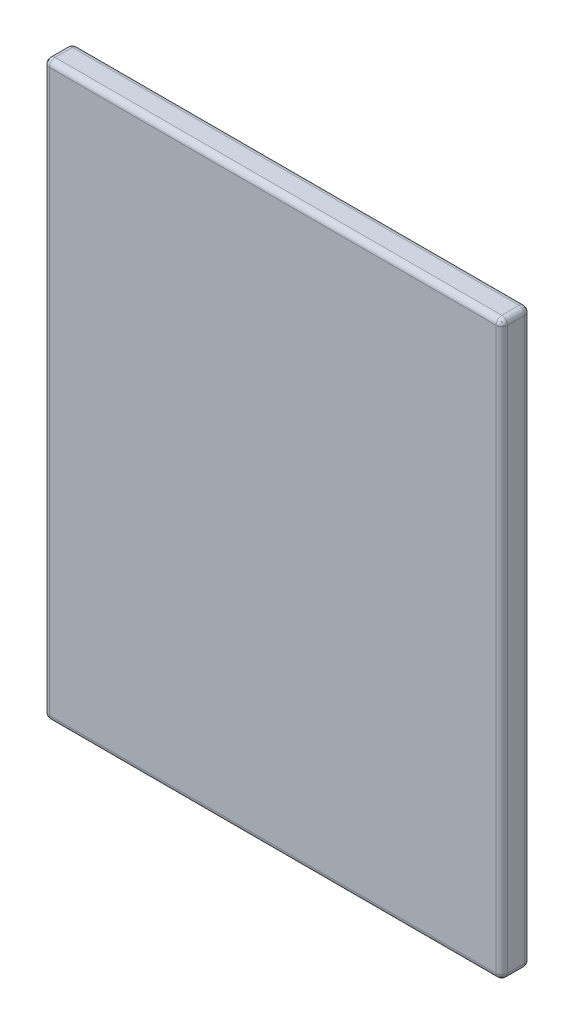
ISO-10303-21;
HEADER;
FILE_DESCRIPTION(('STEP AP214'),'2;1');
FILE_NAME('part.step','',(''),(''),'','','');
FILE_SCHEMA(('AUTOMOTIVE_DESIGN { 1 0 10303 214 1 1 1 1 }'));
ENDSEC;
DATA;
#1=APPLICATION_CONTEXT('core data for automotive mechanical design processes');
#2=APPLICATION_PROTOCOL_DEFINITION('international standard','automotive_design',2000,#1);
#3=PRODUCT_CONTEXT('',#1,'mechanical');
#4=PRODUCT('Part','Part','',(#3));
#5=PRODUCT_RELATED_PRODUCT_CATEGORY('part','',(#4));
#6=PRODUCT_DEFINITION_FORMATION('','',#4);
#7=PRODUCT_DEFINITION_CONTEXT('part definition',#1,'design');
#8=PRODUCT_DEFINITION('design','',#6,#7);
#9=PRODUCT_DEFINITION_SHAPE('','',#8);
#10=(LENGTH_UNIT() NAMED_UNIT(*) SI_UNIT(.MILLI.,.METRE.));
#11=(NAMED_UNIT(*) PLANE_ANGLE_UNIT() SI_UNIT($,.RADIAN.));
#12=(NAMED_UNIT(*) SI_UNIT($,.STERADIAN.) SOLID_ANGLE_UNIT());
#13=UNCERTAINTY_MEASURE_WITH_UNIT(LENGTH_MEASURE(1.E-05),#10,'distance_accuracy_value','');
#14=(GEOMETRIC_REPRESENTATION_CONTEXT(3) GLOBAL_UNCERTAINTY_ASSIGNED_CONTEXT((#13)) GLOBAL_UNIT_ASSIGNED_CONTEXT((#10,
#11,#12)) REPRESENTATION_CONTEXT('',''));
#15=CARTESIAN_POINT('',(0.,0.,0.));
#16=DIRECTION('',(0.,0.,1.));
#17=DIRECTION('',(1.,0.,0.));
#18=AXIS2_PLACEMENT_3D('',#15,#16,#17);
#19=CARTESIAN_POINT('',(10.06001206845,13.985864610413,0.01));
#20=DIRECTION('',(-0.577350243953125,-0.577350294426125,-0.577350269189626));
#21=DIRECTION('',(0.707106812094878,-0.707106750278215,-1.15130127653629E-13));
#22=AXIS2_PLACEMENT_3D('',#19,#20,#21);
#23=SPHERICAL_SURFACE('',#22,0.01);
#24=CARTESIAN_POINT('',(10.0542385660105,13.9800911074687,0.00422649730810391));
#25=VERTEX_POINT('',#24);
#26=VERTEX_LOOP('',#25);
#27=FACE_BOUND('',#26,.T.);
#28=CARTESIAN_POINT('',(10.06001206845,13.985864610413,0.01));
#29=DIRECTION('',(0.,0.,-1.));
#30=DIRECTION('',(-1.,0.,0.));
#31=AXIS2_PLACEMENT_3D('',#28,#29,#30);
#32=CIRCLE('',#31,0.01);
#33=CARTESIAN_POINT('',(10.0500120684499,13.9858646099759,0.00999999999999999));
#34=VERTEX_POINT('',#33);
#35=CARTESIAN_POINT('',(10.0600120688871,13.9758646104131,0.01));
#36=VERTEX_POINT('',#35);
#37=EDGE_CURVE('E112',#34,#36,#32,.F.);
#38=ORIENTED_EDGE('',*,*,#37,.F.);
#39=CARTESIAN_POINT('',(10.0600120684497,13.985864610413,0.01));
#40=DIRECTION('',(-4.371138805985E-08,0.999999999999999,0.));
#41=DIRECTION('',(-0.999999999999999,-4.371138805985E-08,0.));
#42=AXIS2_PLACEMENT_3D('',#39,#40,#41);
#43=CIRCLE('',#42,0.01);
#44=CARTESIAN_POINT('',(10.06001206845,13.9858646104131,0.));
#45=VERTEX_POINT('',#44);
#46=EDGE_CURVE('E123',#45,#34,#43,.T.);
#47=ORIENTED_EDGE('',*,*,#46,.F.);
#48=CARTESIAN_POINT('',(10.0600120684499,13.9858646104133,0.00999999999999994));
#49=DIRECTION('',(-0.999999999999999,-4.371138802516E-08,0.));
#50=DIRECTION('',(4.371138802516E-08,-0.999999999999999,0.));
#51=AXIS2_PLACEMENT_3D('',#48,#49,#50);
#52=CIRCLE('',#51,0.01);
#53=EDGE_CURVE('E21',#36,#45,#52,.F.);
#54=ORIENTED_EDGE('',*,*,#53,.F.);
#55=EDGE_LOOP('',(#38,#47,#54));
#56=FACE_BOUND('',#55,.T.);
#57=ADVANCED_FACE('F17',(#27,#56),#23,.T.);
#58=CARTESIAN_POINT('',(10.060012025613,14.965864610413,0.01));
#59=DIRECTION('',(-0.577350294425946,0.577350243952984,-0.577350269189946));
#60=DIRECTION('',(0.707106781186808,3.09081850113912E-08,-0.707106781186286));
#61=AXIS2_PLACEMENT_3D('',#58,#59,#60);
#62=SPHERICAL_SURFACE('',#61,0.01);
#63=CARTESIAN_POINT('',(10.0542385226687,14.9716381128525,0.00422649730810062));
#64=VERTEX_POINT('',#63);
#65=VERTEX_LOOP('',#64);
#66=FACE_BOUND('',#65,.T.);
#67=CARTESIAN_POINT('',(10.060012025613,14.965864610413,0.01));
#68=DIRECTION('',(0.,0.,-1.));
#69=DIRECTION('',(-1.,0.,0.));
#70=AXIS2_PLACEMENT_3D('',#67,#68,#69);
#71=CIRCLE('',#70,0.01);
#72=CARTESIAN_POINT('',(10.0600120251759,14.9758646104133,0.00999999999999999));
#73=VERTEX_POINT('',#72);
#74=CARTESIAN_POINT('',(10.0500120256128,14.9658646099759,0.01));
#75=VERTEX_POINT('',#74);
#76=EDGE_CURVE('E224',#73,#75,#71,.F.);
#77=ORIENTED_EDGE('',*,*,#76,.F.);
#78=CARTESIAN_POINT('',(10.060012025613,14.9658646104138,0.00999999999999998));
#79=DIRECTION('',(0.999999999999999,4.371138802516E-08,0.));
#80=DIRECTION('',(-4.371138802516E-08,0.999999999999999,0.));
#81=AXIS2_PLACEMENT_3D('',#78,#79,#80);
#82=CIRCLE('',#81,0.01);
#83=CARTESIAN_POINT('',(10.0600120256128,14.9658646104135,0.));
#84=VERTEX_POINT('',#83);
#85=EDGE_CURVE('E175',#84,#73,#82,.T.);
#86=ORIENTED_EDGE('',*,*,#85,.F.);
#87=CARTESIAN_POINT('',(10.0600120256126,14.9658646104131,0.01));
#88=DIRECTION('',(-4.371138805985E-08,0.999999999999999,0.));
#89=DIRECTION('',(-0.999999999999999,-4.371138805985E-08,0.));
#90=AXIS2_PLACEMENT_3D('',#87,#88,#89);
#91=CIRCLE('',#90,0.01);
#92=EDGE_CURVE('E180',#75,#84,#91,.F.);
#93=ORIENTED_EDGE('',*,*,#92,.F.);
#94=EDGE_LOOP('',(#77,#86,#93));
#95=FACE_BOUND('',#94,.T.);
#96=ADVANCED_FACE('F167',(#66,#95),#62,.T.);
#97=CARTESIAN_POINT('',(10.84001206845,13.985864644508,0.01));
#98=DIRECTION('',(0.577350294425946,-0.577350243952984,-0.577350269189946));
#99=DIRECTION('',(0.707106781186808,3.09081850113912E-08,0.707106781186286));
#100=AXIS2_PLACEMENT_3D('',#97,#98,#99);
#101=SPHERICAL_SURFACE('',#100,0.01);
#102=CARTESIAN_POINT('',(10.8457855713943,13.9800911420685,0.00422649730810062));
#103=VERTEX_POINT('',#102);
#104=VERTEX_LOOP('',#103);
#105=FACE_BOUND('',#104,.T.);
#106=CARTESIAN_POINT('',(10.84001206845,13.985864644508,0.01));
#107=DIRECTION('',(0.,0.,-1.));
#108=DIRECTION('',(-1.,0.,0.));
#109=AXIS2_PLACEMENT_3D('',#106,#107,#108);
#110=CIRCLE('',#109,0.01);
#111=CARTESIAN_POINT('',(10.8400120688871,13.975864644508,0.00999999999999999));
#112=VERTEX_POINT('',#111);
#113=CARTESIAN_POINT('',(10.85001206845,13.9858646449451,0.01));
#114=VERTEX_POINT('',#113);
#115=EDGE_CURVE('E222',#112,#114,#110,.F.);
#116=ORIENTED_EDGE('',*,*,#115,.F.);
#117=CARTESIAN_POINT('',(10.84001206845,13.9858646445082,0.01));
#118=DIRECTION('',(-0.999999999999999,-4.371138802516E-08,0.));
#119=DIRECTION('',(4.371138802516E-08,-0.999999999999999,0.));
#120=AXIS2_PLACEMENT_3D('',#117,#118,#119);
#121=CIRCLE('',#120,0.01);
#122=CARTESIAN_POINT('',(10.8400120684497,13.985864644508,0.));
#123=VERTEX_POINT('',#122);
#124=EDGE_CURVE('E141',#123,#112,#121,.T.);
#125=ORIENTED_EDGE('',*,*,#124,.F.);
#126=CARTESIAN_POINT('',(10.8400120684494,13.9858646445079,0.01));
#127=DIRECTION('',(4.371138819863E-08,-0.999999999999999,0.));
#128=DIRECTION('',(0.999999999999999,4.371138819863E-08,0.));
#129=AXIS2_PLACEMENT_3D('',#126,#127,#128);
#130=CIRCLE('',#129,0.01);
#131=EDGE_CURVE('E219',#114,#123,#130,.F.);
#132=ORIENTED_EDGE('',*,*,#131,.F.);
#133=EDGE_LOOP('',(#116,#125,#132));
#134=FACE_BOUND('',#133,.T.);
#135=ADVANCED_FACE('F164',(#105,#134),#101,.T.);
#136=CARTESIAN_POINT('',(10.450012047031,14.475864627461,0.));
#137=DIRECTION('',(0.,0.,-1.));
#138=DIRECTION('',(-1.,0.,0.));
#139=AXIS2_PLACEMENT_3D('',#136,#137,#138);
#140=PLANE('',#139);
#141=DIRECTION('',(0.999999999999999,4.371138802516E-08,0.));
#142=VECTOR('',#141,1.);
#143=CARTESIAN_POINT('',(10.250012025613,14.9658646187183,0.));
#144=LINE('',#143,#142);
#145=CARTESIAN_POINT('',(10.8400120256127,14.9658646445084,0.));
#146=VERTEX_POINT('',#145);
#147=EDGE_CURVE('E173',#146,#84,#144,.F.);
#148=ORIENTED_EDGE('',*,*,#147,.F.);
#149=DIRECTION('',(4.371138819863E-08,-0.999999999999999,0.));
#150=VECTOR('',#149,1.);
#151=CARTESIAN_POINT('',(10.8400120361036,14.725864644508,0.));
#152=LINE('',#151,#150);
#153=EDGE_CURVE('E152',#123,#146,#152,.F.);
#154=ORIENTED_EDGE('',*,*,#153,.F.);
#155=DIRECTION('',(-0.999999999999999,-4.371138802516E-08,0.));
#156=VECTOR('',#155,1.);
#157=CARTESIAN_POINT('',(10.65001206845,13.9858646362027,0.));
#158=LINE('',#157,#156);
#159=EDGE_CURVE('E138',#45,#123,#158,.F.);
#160=ORIENTED_EDGE('',*,*,#159,.F.);
#161=DIRECTION('',(-4.371138805985E-08,0.999999999999999,0.));
#162=VECTOR('',#161,1.);
#163=CARTESIAN_POINT('',(10.0600120579594,14.225864610413,0.));
#164=LINE('',#163,#162);
#165=EDGE_CURVE('E178',#84,#45,#164,.F.);
#166=ORIENTED_EDGE('',*,*,#165,.F.);
#167=EDGE_LOOP('',(#148,#154,#160,#166));
#168=FACE_BOUND('',#167,.T.);
#169=ADVANCED_FACE('F159',(#168),#140,.T.);
#170=CARTESIAN_POINT('',(10.840012025613,14.965864644508,0.01));
#171=DIRECTION('',(0.577350243952805,0.577350294426266,-0.577350269189805));
#172=DIRECTION('',(0.707106781186693,3.09085931571307E-08,0.707106781186401));
#173=AXIS2_PLACEMENT_3D('',#170,#171,#172);
#174=SPHERICAL_SURFACE('',#173,0.01);
#175=CARTESIAN_POINT('',(10.8457855280525,14.9716381474523,0.00422649730810214));
#176=VERTEX_POINT('',#175);
#177=VERTEX_LOOP('',#176);
#178=FACE_BOUND('',#177,.T.);
#179=CARTESIAN_POINT('',(10.840012025613,14.965864644508,0.01));
#180=DIRECTION('',(0.,0.,-1.));
#181=DIRECTION('',(-1.,0.,0.));
#182=AXIS2_PLACEMENT_3D('',#179,#180,#181);
#183=CIRCLE('',#182,0.01);
#184=CARTESIAN_POINT('',(10.8500120256129,14.9658646449451,0.00999999999999999));
#185=VERTEX_POINT('',#184);
#186=CARTESIAN_POINT('',(10.8400120251759,14.9758646445082,0.01));
#187=VERTEX_POINT('',#186);
#188=EDGE_CURVE('E133',#185,#187,#183,.F.);
#189=ORIENTED_EDGE('',*,*,#188,.F.);
#190=CARTESIAN_POINT('',(10.8400120256123,14.965864644508,0.01));
#191=DIRECTION('',(4.371138819863E-08,-0.999999999999999,0.));
#192=DIRECTION('',(0.999999999999999,4.371138819863E-08,0.));
#193=AXIS2_PLACEMENT_3D('',#190,#191,#192);
#194=CIRCLE('',#193,0.01);
#195=EDGE_CURVE('E217',#146,#185,#194,.T.);
#196=ORIENTED_EDGE('',*,*,#195,.F.);
#197=CARTESIAN_POINT('',(10.8400120256131,14.9658646445087,0.0100000000000001));
#198=DIRECTION('',(0.999999999999999,4.371138802516E-08,0.));
#199=DIRECTION('',(-4.371138802516E-08,0.999999999999999,0.));
#200=AXIS2_PLACEMENT_3D('',#197,#198,#199);
#201=CIRCLE('',#200,0.01);
#202=EDGE_CURVE('E122',#187,#146,#201,.F.);
#203=ORIENTED_EDGE('',*,*,#202,.F.);
#204=EDGE_LOOP('',(#189,#196,#203));
#205=FACE_BOUND('',#204,.T.);
#206=ADVANCED_FACE('F155',(#178,#205),#174,.T.);
#207=CARTESIAN_POINT('',(10.65001206845,13.985864636203,0.01));
#208=DIRECTION('',(-0.999999999999999,-4.371138802516E-08,0.));
#209=DIRECTION('',(4.371138802516E-08,-0.999999999999999,0.));
#210=AXIS2_PLACEMENT_3D('',#207,#208,#209);
#211=CYLINDRICAL_SURFACE('',#210,0.01);
#212=ORIENTED_EDGE('',*,*,#124,.T.);
#213=DIRECTION('',(0.999999999999999,4.371138802516E-08,0.));
#214=VECTOR('',#213,1.);
#215=CARTESIAN_POINT('',(10.850012068887,13.975864644945,0.00999999999999999));
#216=LINE('',#215,#214);
#217=EDGE_CURVE('E129',#36,#112,#216,.T.);
#218=ORIENTED_EDGE('',*,*,#217,.F.);
#219=ORIENTED_EDGE('',*,*,#53,.T.);
#220=ORIENTED_EDGE('',*,*,#159,.T.);
#221=EDGE_LOOP('',(#212,#218,#219,#220));
#222=FACE_BOUND('',#221,.T.);
#223=ADVANCED_FACE('F139',(#222),#211,.T.);
#224=CARTESIAN_POINT('',(10.060012057959,14.225864610413,0.01));
#225=DIRECTION('',(-4.371138805985E-08,0.999999999999999,0.));
#226=DIRECTION('',(-0.999999999999999,-4.371138805985E-08,0.));
#227=AXIS2_PLACEMENT_3D('',#224,#225,#226);
#228=CYLINDRICAL_SURFACE('',#227,0.01);
#229=ORIENTED_EDGE('',*,*,#46,.T.);
#230=DIRECTION('',(4.371138805985E-08,-0.999999999999999,0.));
#231=VECTOR('',#230,1.);
#232=CARTESIAN_POINT('',(10.050012068887,13.975864609976,0.00999999999999999));
#233=LINE('',#232,#231);
#234=EDGE_CURVE('E148',#75,#34,#233,.T.);
#235=ORIENTED_EDGE('',*,*,#234,.F.);
#236=ORIENTED_EDGE('',*,*,#92,.T.);
#237=ORIENTED_EDGE('',*,*,#165,.T.);
#238=EDGE_LOOP('',(#229,#235,#236,#237));
#239=FACE_BOUND('',#238,.T.);
#240=ADVANCED_FACE('F233',(#239),#228,.T.);
#241=CARTESIAN_POINT('',(10.06001206845,13.985864610413,0.05));
#242=DIRECTION('',(0.,0.,-1.));
#243=DIRECTION('',(-1.,0.,0.));
#244=AXIS2_PLACEMENT_3D('',#241,#242,#243);
#245=CYLINDRICAL_SURFACE('',#244,0.01);
#246=CARTESIAN_POINT('',(10.06001206845,13.985864610413,0.04));
#247=DIRECTION('',(0.,0.,-1.));
#248=DIRECTION('',(-1.,0.,0.));
#249=AXIS2_PLACEMENT_3D('',#246,#247,#248);
#250=CIRCLE('',#249,0.01);
#251=CARTESIAN_POINT('',(10.0500120684498,13.9858646099759,0.04));
#252=VERTEX_POINT('',#251);
#253=CARTESIAN_POINT('',(10.0600120688871,13.9758646104131,0.04));
#254=VERTEX_POINT('',#253);
#255=EDGE_CURVE('E144',#252,#254,#250,.F.);
#256=ORIENTED_EDGE('',*,*,#255,.F.);
#257=DIRECTION('',(0.,0.,1.));
#258=VECTOR('',#257,1.);
#259=CARTESIAN_POINT('',(10.0500120684499,13.985864609976,0.05));
#260=LINE('',#259,#258);
#261=EDGE_CURVE('E118',#34,#252,#260,.T.);
#262=ORIENTED_EDGE('',*,*,#261,.F.);
#263=ORIENTED_EDGE('',*,*,#37,.T.);
#264=DIRECTION('',(0.,0.,1.));
#265=VECTOR('',#264,1.);
#266=CARTESIAN_POINT('',(10.060012068887,13.975864610413,0.05));
#267=LINE('',#266,#265);
#268=EDGE_CURVE('E116',#254,#36,#267,.F.);
#269=ORIENTED_EDGE('',*,*,#268,.F.);
#270=EDGE_LOOP('',(#256,#262,#263,#269));
#271=FACE_BOUND('',#270,.T.);
#272=ADVANCED_FACE('F115',(#271),#245,.T.);
#273=CARTESIAN_POINT('',(10.250012025613,14.965864618719,0.01));
#274=DIRECTION('',(0.999999999999999,4.371138802516E-08,0.));
#275=DIRECTION('',(-4.371138802516E-08,0.999999999999999,0.));
#276=AXIS2_PLACEMENT_3D('',#273,#274,#275);
#277=CYLINDRICAL_SURFACE('',#276,0.01);
#278=ORIENTED_EDGE('',*,*,#85,.T.);
#279=DIRECTION('',(-0.999999999999999,-4.371138802516E-08,0.));
#280=VECTOR('',#279,1.);
#281=CARTESIAN_POINT('',(10.050012025176,14.975864609976,0.00999999999999999));
#282=LINE('',#281,#280);
#283=EDGE_CURVE('E318',#187,#73,#282,.T.);
#284=ORIENTED_EDGE('',*,*,#283,.F.);
#285=ORIENTED_EDGE('',*,*,#202,.T.);
#286=ORIENTED_EDGE('',*,*,#147,.T.);
#287=EDGE_LOOP('',(#278,#284,#285,#286));
#288=FACE_BOUND('',#287,.T.);
#289=ADVANCED_FACE('F244',(#288),#277,.T.);
#290=CARTESIAN_POINT('',(10.060012025613,14.965864610413,0.05));
#291=DIRECTION('',(0.,0.,-1.));
#292=DIRECTION('',(-1.,0.,0.));
#293=AXIS2_PLACEMENT_3D('',#290,#291,#292);
#294=CYLINDRICAL_SURFACE('',#293,0.01);
#295=CARTESIAN_POINT('',(10.060012025613,14.965864610413,0.04));
#296=DIRECTION('',(0.,0.,-1.));
#297=DIRECTION('',(-1.,0.,0.));
#298=AXIS2_PLACEMENT_3D('',#295,#296,#297);
#299=CIRCLE('',#298,0.01);
#300=CARTESIAN_POINT('',(10.0600120251759,14.9758646104135,0.04));
#301=VERTEX_POINT('',#300);
#302=CARTESIAN_POINT('',(10.0500120256127,14.9658646099759,0.04));
#303=VERTEX_POINT('',#302);
#304=EDGE_CURVE('E211',#301,#303,#299,.F.);
#305=ORIENTED_EDGE('',*,*,#304,.F.);
#306=DIRECTION('',(0.,0.,1.));
#307=VECTOR('',#306,1.);
#308=CARTESIAN_POINT('',(10.060012025176,14.9758646104131,0.05));
#309=LINE('',#308,#307);
#310=EDGE_CURVE('E210',#73,#301,#309,.T.);
#311=ORIENTED_EDGE('',*,*,#310,.F.);
#312=ORIENTED_EDGE('',*,*,#76,.T.);
#313=DIRECTION('',(0.,0.,1.));
#314=VECTOR('',#313,1.);
#315=CARTESIAN_POINT('',(10.0500120256127,14.965864609976,0.05));
#316=LINE('',#315,#314);
#317=EDGE_CURVE('E215',#303,#75,#316,.F.);
#318=ORIENTED_EDGE('',*,*,#317,.F.);
#319=EDGE_LOOP('',(#305,#311,#312,#318));
#320=FACE_BOUND('',#319,.T.);
#321=ADVANCED_FACE('F352',(#320),#294,.T.);
#322=CARTESIAN_POINT('',(10.84001206845,13.985864644508,0.05));
#323=DIRECTION('',(0.,0.,-1.));
#324=DIRECTION('',(-1.,0.,0.));
#325=AXIS2_PLACEMENT_3D('',#322,#323,#324);
#326=CYLINDRICAL_SURFACE('',#325,0.01);
#327=CARTESIAN_POINT('',(10.84001206845,13.985864644508,0.04));
#328=DIRECTION('',(0.,0.,-1.));
#329=DIRECTION('',(-1.,0.,0.));
#330=AXIS2_PLACEMENT_3D('',#327,#328,#329);
#331=CIRCLE('',#330,0.01);
#332=CARTESIAN_POINT('',(10.8400120688871,13.975864644508,0.04));
#333=VERTEX_POINT('',#332);
#334=CARTESIAN_POINT('',(10.8500120684499,13.9858646449451,0.04));
#335=VERTEX_POINT('',#334);
#336=EDGE_CURVE('E205',#333,#335,#331,.F.);
#337=ORIENTED_EDGE('',*,*,#336,.F.);
#338=DIRECTION('',(0.,0.,1.));
#339=VECTOR('',#338,1.);
#340=CARTESIAN_POINT('',(10.840012068887,13.9758646445079,0.05));
#341=LINE('',#340,#339);
#342=EDGE_CURVE('E142',#112,#333,#341,.T.);
#343=ORIENTED_EDGE('',*,*,#342,.F.);
#344=ORIENTED_EDGE('',*,*,#115,.T.);
#345=DIRECTION('',(0.,0.,1.));
#346=VECTOR('',#345,1.);
#347=CARTESIAN_POINT('',(10.8500120684503,13.985864644945,0.05));
#348=LINE('',#347,#346);
#349=EDGE_CURVE('E207',#335,#114,#348,.F.);
#350=ORIENTED_EDGE('',*,*,#349,.F.);
#351=EDGE_LOOP('',(#337,#343,#344,#350));
#352=FACE_BOUND('',#351,.T.);
#353=ADVANCED_FACE('F374',(#352),#326,.T.);
#354=CARTESIAN_POINT('',(10.840012036103,14.725864644508,0.01));
#355=DIRECTION('',(4.371138819863E-08,-0.999999999999999,0.));
#356=DIRECTION('',(0.999999999999999,4.371138819863E-08,0.));
#357=AXIS2_PLACEMENT_3D('',#354,#355,#356);
#358=CYLINDRICAL_SURFACE('',#357,0.01);
#359=ORIENTED_EDGE('',*,*,#195,.T.);
#360=DIRECTION('',(-4.371138819863E-08,0.999999999999999,0.));
#361=VECTOR('',#360,1.);
#362=CARTESIAN_POINT('',(10.850012025176,14.975864644945,0.00999999999999999));
#363=LINE('',#362,#361);
#364=EDGE_CURVE('E310',#114,#185,#363,.T.);
#365=ORIENTED_EDGE('',*,*,#364,.F.);
#366=ORIENTED_EDGE('',*,*,#131,.T.);
#367=ORIENTED_EDGE('',*,*,#153,.T.);
#368=EDGE_LOOP('',(#359,#365,#366,#367));
#369=FACE_BOUND('',#368,.T.);
#370=ADVANCED_FACE('F421',(#369),#358,.T.);
#371=CARTESIAN_POINT('',(10.840012025613,14.965864644508,0.05));
#372=DIRECTION('',(0.,0.,-1.));
#373=DIRECTION('',(-1.,0.,0.));
#374=AXIS2_PLACEMENT_3D('',#371,#372,#373);
#375=CYLINDRICAL_SURFACE('',#374,0.01);
#376=CARTESIAN_POINT('',(10.840012025613,14.965864644508,0.04));
#377=DIRECTION('',(0.,0.,-1.));
#378=DIRECTION('',(-1.,0.,0.));
#379=AXIS2_PLACEMENT_3D('',#376,#377,#378);
#380=CIRCLE('',#379,0.01);
#381=CARTESIAN_POINT('',(10.8500120256127,14.9658646449451,0.04));
#382=VERTEX_POINT('',#381);
#383=CARTESIAN_POINT('',(10.8400120251759,14.9758646445084,0.04));
#384=VERTEX_POINT('',#383);
#385=EDGE_CURVE('E208',#382,#384,#380,.F.);
#386=ORIENTED_EDGE('',*,*,#385,.F.);
#387=DIRECTION('',(0.,0.,1.));
#388=VECTOR('',#387,1.);
#389=CARTESIAN_POINT('',(10.8500120256131,14.965864644945,0.05));
#390=LINE('',#389,#388);
#391=EDGE_CURVE('E204',#185,#382,#390,.T.);
#392=ORIENTED_EDGE('',*,*,#391,.F.);
#393=ORIENTED_EDGE('',*,*,#188,.T.);
#394=DIRECTION('',(0.,0.,1.));
#395=VECTOR('',#394,1.);
#396=CARTESIAN_POINT('',(10.840012025176,14.975864644508,0.05));
#397=LINE('',#396,#395);
#398=EDGE_CURVE('E213',#384,#187,#397,.F.);
#399=ORIENTED_EDGE('',*,*,#398,.F.);
#400=EDGE_LOOP('',(#386,#392,#393,#399));
#401=FACE_BOUND('',#400,.T.);
#402=ADVANCED_FACE('F382',(#401),#375,.T.);
#403=CARTESIAN_POINT('',(10.850012068887,13.975864644945,0.05));
#404=DIRECTION('',(4.371138802516E-08,-0.999999999999999,0.));
#405=DIRECTION('',(0.999999999999999,4.371138802516E-08,0.));
#406=AXIS2_PLACEMENT_3D('',#403,#404,#405);
#407=PLANE('',#406);
#408=ORIENTED_EDGE('',*,*,#342,.T.);
#409=DIRECTION('',(0.999999999999999,4.371138802516E-08,0.));
#410=VECTOR('',#409,1.);
#411=CARTESIAN_POINT('',(10.6500120688871,13.975864636203,0.0400000000000001));
#412=LINE('',#411,#410);
#413=EDGE_CURVE('E132',#254,#333,#412,.T.);
#414=ORIENTED_EDGE('',*,*,#413,.F.);
#415=ORIENTED_EDGE('',*,*,#268,.T.);
#416=ORIENTED_EDGE('',*,*,#217,.T.);
#417=EDGE_LOOP('',(#408,#414,#415,#416));
#418=FACE_BOUND('',#417,.T.);
#419=ADVANCED_FACE('F127',(#418),#407,.T.);
#420=CARTESIAN_POINT('',(10.06001206845,13.985864610413,0.04));
#421=DIRECTION('',(-0.577350243952805,-0.577350294426266,0.577350269189805));
#422=DIRECTION('',(-0.707106781186693,-3.09085931571307E-08,-0.707106781186401));
#423=AXIS2_PLACEMENT_3D('',#420,#421,#422);
#424=SPHERICAL_SURFACE('',#423,0.01);
#425=CARTESIAN_POINT('',(10.0542385660105,13.9800911074687,0.0457735026918979));
#426=VERTEX_POINT('',#425);
#427=VERTEX_LOOP('',#426);
#428=FACE_BOUND('',#427,.T.);
#429=CARTESIAN_POINT('',(10.0600120684497,13.9858646104131,0.04));
#430=DIRECTION('',(4.371138805985E-08,-0.999999999999999,0.));
#431=DIRECTION('',(0.999999999999999,4.371138805985E-08,0.));
#432=AXIS2_PLACEMENT_3D('',#429,#430,#431);
#433=CIRCLE('',#432,0.01);
#434=CARTESIAN_POINT('',(10.0600120684499,13.9858646274606,0.05));
#435=VERTEX_POINT('',#434);
#436=EDGE_CURVE('E197',#252,#435,#433,.F.);
#437=ORIENTED_EDGE('',*,*,#436,.F.);
#438=ORIENTED_EDGE('',*,*,#255,.T.);
#439=CARTESIAN_POINT('',(10.06001206845,13.9858646104133,0.0399999999999999));
#440=DIRECTION('',(0.999999999999999,4.371138802516E-08,0.));
#441=DIRECTION('',(-4.371138802516E-08,0.999999999999999,0.));
#442=AXIS2_PLACEMENT_3D('',#439,#440,#441);
#443=CIRCLE('',#442,0.01);
#444=EDGE_CURVE('E199',#435,#254,#443,.T.);
#445=ORIENTED_EDGE('',*,*,#444,.F.);
#446=EDGE_LOOP('',(#437,#438,#445));
#447=FACE_BOUND('',#446,.T.);
#448=ADVANCED_FACE('F333',(#428,#447),#424,.T.);
#449=CARTESIAN_POINT('',(10.050012068887,13.975864609976,0.05));
#450=DIRECTION('',(-0.999999999999999,-4.371138805985E-08,0.));
#451=DIRECTION('',(4.371138805985E-08,-0.999999999999999,0.));
#452=AXIS2_PLACEMENT_3D('',#449,#450,#451);
#453=PLANE('',#452);
#454=ORIENTED_EDGE('',*,*,#234,.T.);
#455=ORIENTED_EDGE('',*,*,#261,.T.);
#456=DIRECTION('',(4.371138805985E-08,-0.999999999999999,0.));
#457=VECTOR('',#456,1.);
#458=CARTESIAN_POINT('',(10.050012057959,14.2258646099759,0.04));
#459=LINE('',#458,#457);
#460=EDGE_CURVE('E193',#303,#252,#459,.T.);
#461=ORIENTED_EDGE('',*,*,#460,.F.);
#462=ORIENTED_EDGE('',*,*,#317,.T.);
#463=EDGE_LOOP('',(#454,#455,#461,#462));
#464=FACE_BOUND('',#463,.T.);
#465=ADVANCED_FACE('F329',(#464),#453,.T.);
#466=CARTESIAN_POINT('',(10.060012025613,14.965864610413,0.04));
#467=DIRECTION('',(-0.577350294425946,0.577350243952984,0.577350269189946));
#468=DIRECTION('',(-0.707106781186808,-3.09081850113912E-08,-0.707106781186286));
#469=AXIS2_PLACEMENT_3D('',#466,#467,#468);
#470=SPHERICAL_SURFACE('',#469,0.01);
#471=CARTESIAN_POINT('',(10.0542385226687,14.9716381128525,0.0457735026918994));
#472=VERTEX_POINT('',#471);
#473=VERTEX_LOOP('',#472);
#474=FACE_BOUND('',#473,.T.);
#475=CARTESIAN_POINT('',(10.0600120256131,14.9658646104138,0.04));
#476=DIRECTION('',(-0.999999999999999,-4.371138802516E-08,0.));
#477=DIRECTION('',(4.371138802516E-08,-0.999999999999999,0.));
#478=AXIS2_PLACEMENT_3D('',#475,#476,#477);
#479=CIRCLE('',#478,0.01);
#480=CARTESIAN_POINT('',(10.0600120470313,14.965864610413,0.05));
#481=VERTEX_POINT('',#480);
#482=EDGE_CURVE('E191',#301,#481,#479,.F.);
#483=ORIENTED_EDGE('',*,*,#482,.F.);
#484=ORIENTED_EDGE('',*,*,#304,.T.);
#485=CARTESIAN_POINT('',(10.0600120256126,14.965864610413,0.04));
#486=DIRECTION('',(4.371138805985E-08,-0.999999999999999,0.));
#487=DIRECTION('',(0.999999999999999,4.371138805985E-08,0.));
#488=AXIS2_PLACEMENT_3D('',#485,#486,#487);
#489=CIRCLE('',#488,0.01);
#490=EDGE_CURVE('E194',#481,#303,#489,.T.);
#491=ORIENTED_EDGE('',*,*,#490,.F.);
#492=EDGE_LOOP('',(#483,#484,#491));
#493=FACE_BOUND('',#492,.T.);
#494=ADVANCED_FACE('F325',(#474,#493),#470,.T.);
#495=CARTESIAN_POINT('',(10.050012025176,14.975864609976,0.05));
#496=DIRECTION('',(-4.371138802516E-08,0.999999999999999,0.));
#497=DIRECTION('',(-0.999999999999999,-4.371138802516E-08,0.));
#498=AXIS2_PLACEMENT_3D('',#495,#496,#497);
#499=PLANE('',#498);
#500=ORIENTED_EDGE('',*,*,#310,.T.);
#501=DIRECTION('',(-0.999999999999999,-4.371138802516E-08,0.));
#502=VECTOR('',#501,1.);
#503=CARTESIAN_POINT('',(10.2500120251759,14.975864618719,0.0399999999999999));
#504=LINE('',#503,#502);
#505=EDGE_CURVE('E187',#384,#301,#504,.T.);
#506=ORIENTED_EDGE('',*,*,#505,.F.);
#507=ORIENTED_EDGE('',*,*,#398,.T.);
#508=ORIENTED_EDGE('',*,*,#283,.T.);
#509=EDGE_LOOP('',(#500,#506,#507,#508));
#510=FACE_BOUND('',#509,.T.);
#511=ADVANCED_FACE('F328',(#510),#499,.T.);
#512=CARTESIAN_POINT('',(10.840012025613,14.965864644508,0.04));
#513=DIRECTION('',(0.577350243953125,0.577350294426125,0.577350269189626));
#514=DIRECTION('',(-0.707106812094878,0.707106750278215,1.15130127653629E-13));
#515=AXIS2_PLACEMENT_3D('',#512,#513,#514);
#516=SPHERICAL_SURFACE('',#515,0.01);
#517=CARTESIAN_POINT('',(10.8457855280525,14.9716381474523,0.0457735026918961));
#518=VERTEX_POINT('',#517);
#519=VERTEX_LOOP('',#518);
#520=FACE_BOUND('',#519,.T.);
#521=CARTESIAN_POINT('',(10.8400120256123,14.9658646445079,0.04));
#522=DIRECTION('',(-4.371138819863E-08,0.999999999999999,0.));
#523=DIRECTION('',(-0.999999999999999,-4.371138819863E-08,0.));
#524=AXIS2_PLACEMENT_3D('',#521,#522,#523);
#525=CIRCLE('',#524,0.01);
#526=CARTESIAN_POINT('',(10.840012025613,14.9658646274609,0.05));
#527=VERTEX_POINT('',#526);
#528=EDGE_CURVE('E35',#382,#527,#525,.F.);
#529=ORIENTED_EDGE('',*,*,#528,.F.);
#530=ORIENTED_EDGE('',*,*,#385,.T.);
#531=CARTESIAN_POINT('',(10.840012025613,14.9658646445087,0.0400000000000001));
#532=DIRECTION('',(-0.999999999999999,-4.371138802516E-08,0.));
#533=DIRECTION('',(4.371138802516E-08,-0.999999999999999,0.));
#534=AXIS2_PLACEMENT_3D('',#531,#532,#533);
#535=CIRCLE('',#534,0.01);
#536=EDGE_CURVE('E188',#527,#384,#535,.T.);
#537=ORIENTED_EDGE('',*,*,#536,.F.);
#538=EDGE_LOOP('',(#529,#530,#537));
#539=FACE_BOUND('',#538,.T.);
#540=ADVANCED_FACE('F298',(#520,#539),#516,.T.);
#541=CARTESIAN_POINT('',(10.84001206845,13.985864644508,0.04));
#542=DIRECTION('',(0.577350294425946,-0.577350243952984,0.577350269189946));
#543=DIRECTION('',(-0.707106781186808,-3.09081850113912E-08,0.707106781186286));
#544=AXIS2_PLACEMENT_3D('',#541,#542,#543);
#545=SPHERICAL_SURFACE('',#544,0.01);
#546=CARTESIAN_POINT('',(10.8457855713943,13.9800911420685,0.0457735026918994));
#547=VERTEX_POINT('',#546);
#548=VERTEX_LOOP('',#547);
#549=FACE_BOUND('',#548,.T.);
#550=CARTESIAN_POINT('',(10.8400120684494,13.985864644508,0.04));
#551=DIRECTION('',(-4.371138819863E-08,0.999999999999999,0.));
#552=DIRECTION('',(-0.999999999999999,-4.371138819863E-08,0.));
#553=AXIS2_PLACEMENT_3D('',#550,#551,#552);
#554=CIRCLE('',#553,0.01);
#555=CARTESIAN_POINT('',(10.8400120470314,13.9858646445081,0.05));
#556=VERTEX_POINT('',#555);
#557=EDGE_CURVE('E182',#556,#335,#554,.T.);
#558=ORIENTED_EDGE('',*,*,#557,.F.);
#559=CARTESIAN_POINT('',(10.8400120684499,13.9858646445082,0.04));
#560=DIRECTION('',(0.999999999999999,4.371138802516E-08,0.));
#561=DIRECTION('',(-4.371138802516E-08,0.999999999999999,0.));
#562=AXIS2_PLACEMENT_3D('',#559,#560,#561);
#563=CIRCLE('',#562,0.01);
#564=EDGE_CURVE('E202',#333,#556,#563,.F.);
#565=ORIENTED_EDGE('',*,*,#564,.F.);
#566=ORIENTED_EDGE('',*,*,#336,.T.);
#567=EDGE_LOOP('',(#558,#565,#566));
#568=FACE_BOUND('',#567,.T.);
#569=ADVANCED_FACE('F293',(#549,#568),#545,.T.);
#570=CARTESIAN_POINT('',(10.850012025176,14.975864644945,0.05));
#571=DIRECTION('',(0.999999999999999,4.371138819863E-08,0.));
#572=DIRECTION('',(-4.371138819863E-08,0.999999999999999,0.));
#573=AXIS2_PLACEMENT_3D('',#570,#571,#572);
#574=PLANE('',#573);
#575=ORIENTED_EDGE('',*,*,#364,.T.);
#576=ORIENTED_EDGE('',*,*,#391,.T.);
#577=DIRECTION('',(-4.371138819863E-08,0.999999999999999,0.));
#578=VECTOR('',#577,1.);
#579=CARTESIAN_POINT('',(10.850012036103,14.7258646449451,0.04));
#580=LINE('',#579,#578);
#581=EDGE_CURVE('E185',#335,#382,#580,.T.);
#582=ORIENTED_EDGE('',*,*,#581,.F.);
#583=ORIENTED_EDGE('',*,*,#349,.T.);
#584=EDGE_LOOP('',(#575,#576,#582,#583));
#585=FACE_BOUND('',#584,.T.);
#586=ADVANCED_FACE('F289',(#585),#574,.T.);
#587=CARTESIAN_POINT('',(10.65001206845,13.985864636203,0.04));
#588=DIRECTION('',(0.999999999999999,4.371138802516E-08,0.));
#589=DIRECTION('',(-4.371138802516E-08,0.999999999999999,0.));
#590=AXIS2_PLACEMENT_3D('',#587,#588,#589);
#591=CYLINDRICAL_SURFACE('',#590,0.01);
#592=ORIENTED_EDGE('',*,*,#444,.T.);
#593=ORIENTED_EDGE('',*,*,#413,.T.);
#594=ORIENTED_EDGE('',*,*,#564,.T.);
#595=DIRECTION('',(-1.,0.,0.));
#596=VECTOR('',#595,1.);
#597=CARTESIAN_POINT('',(10.450012047031,13.985864644508,0.05));
#598=LINE('',#597,#596);
#599=EDGE_CURVE('E304',#556,#435,#598,.T.);
#600=ORIENTED_EDGE('',*,*,#599,.T.);
#601=EDGE_LOOP('',(#592,#593,#594,#600));
#602=FACE_BOUND('',#601,.T.);
#603=ADVANCED_FACE('F285',(#602),#591,.T.);
#604=CARTESIAN_POINT('',(10.060012057959,14.225864610413,0.04));
#605=DIRECTION('',(4.371138805985E-08,-0.999999999999999,0.));
#606=DIRECTION('',(0.999999999999999,4.371138805985E-08,0.));
#607=AXIS2_PLACEMENT_3D('',#604,#605,#606);
#608=CYLINDRICAL_SURFACE('',#607,0.01);
#609=ORIENTED_EDGE('',*,*,#490,.T.);
#610=ORIENTED_EDGE('',*,*,#460,.T.);
#611=ORIENTED_EDGE('',*,*,#436,.T.);
#612=DIRECTION('',(0.,1.,0.));
#613=VECTOR('',#612,1.);
#614=CARTESIAN_POINT('',(10.06001206845,14.475864627461,0.05));
#615=LINE('',#614,#613);
#616=EDGE_CURVE('E306',#435,#481,#615,.T.);
#617=ORIENTED_EDGE('',*,*,#616,.T.);
#618=EDGE_LOOP('',(#609,#610,#611,#617));
#619=FACE_BOUND('',#618,.T.);
#620=ADVANCED_FACE('F281',(#619),#608,.T.);
#621=CARTESIAN_POINT('',(10.250012025613,14.965864618719,0.04));
#622=DIRECTION('',(-0.999999999999999,-4.371138802516E-08,0.));
#623=DIRECTION('',(4.371138802516E-08,-0.999999999999999,0.));
#624=AXIS2_PLACEMENT_3D('',#621,#622,#623);
#625=CYLINDRICAL_SURFACE('',#624,0.01);
#626=ORIENTED_EDGE('',*,*,#536,.T.);
#627=ORIENTED_EDGE('',*,*,#505,.T.);
#628=ORIENTED_EDGE('',*,*,#482,.T.);
#629=DIRECTION('',(-1.,0.,0.));
#630=VECTOR('',#629,1.);
#631=CARTESIAN_POINT('',(10.450012047031,14.965864610413,0.05));
#632=LINE('',#631,#630);
#633=EDGE_CURVE('E27',#481,#527,#632,.F.);
#634=ORIENTED_EDGE('',*,*,#633,.T.);
#635=EDGE_LOOP('',(#626,#627,#628,#634));
#636=FACE_BOUND('',#635,.T.);
#637=ADVANCED_FACE('F275',(#636),#625,.T.);
#638=CARTESIAN_POINT('',(10.840012036103,14.725864644508,0.04));
#639=DIRECTION('',(-4.371138819863E-08,0.999999999999999,0.));
#640=DIRECTION('',(-0.999999999999999,-4.371138819863E-08,0.));
#641=AXIS2_PLACEMENT_3D('',#638,#639,#640);
#642=CYLINDRICAL_SURFACE('',#641,0.01);
#643=ORIENTED_EDGE('',*,*,#557,.T.);
#644=ORIENTED_EDGE('',*,*,#581,.T.);
#645=ORIENTED_EDGE('',*,*,#528,.T.);
#646=DIRECTION('',(0.,1.,0.));
#647=VECTOR('',#646,1.);
#648=CARTESIAN_POINT('',(10.840012025613,14.475864627461,0.05));
#649=LINE('',#648,#647);
#650=EDGE_CURVE('E11',#527,#556,#649,.F.);
#651=ORIENTED_EDGE('',*,*,#650,.T.);
#652=EDGE_LOOP('',(#643,#644,#645,#651));
#653=FACE_BOUND('',#652,.T.);
#654=ADVANCED_FACE('F269',(#653),#642,.T.);
#655=CARTESIAN_POINT('',(10.450012047031,14.475864627461,0.05));
#656=DIRECTION('',(0.,0.,-1.));
#657=DIRECTION('',(-1.,0.,0.));
#658=AXIS2_PLACEMENT_3D('',#655,#656,#657);
#659=PLANE('',#658);
#660=ORIENTED_EDGE('',*,*,#633,.F.);
#661=ORIENTED_EDGE('',*,*,#616,.F.);
#662=ORIENTED_EDGE('',*,*,#599,.F.);
#663=ORIENTED_EDGE('',*,*,#650,.F.);
#664=EDGE_LOOP('',(#660,#661,#662,#663));
#665=FACE_BOUND('',#664,.T.);
#666=ADVANCED_FACE('F267',(#665),#659,.F.);
#667=CLOSED_SHELL('',(#57,#96,#135,#169,#206,#223,#240,#272,#289,#321,#353,#370,#402,#419,#448,
#465,#494,#511,#540,#569,#586,#603,#620,#637,#654,#666));
#668=MANIFOLD_SOLID_BREP('B1',#667);
#669=ADVANCED_BREP_SHAPE_REPRESENTATION('',(#18,#668),#14);
#670=SHAPE_DEFINITION_REPRESENTATION(#9,#669);
ENDSEC;
END-ISO-10303-21;
